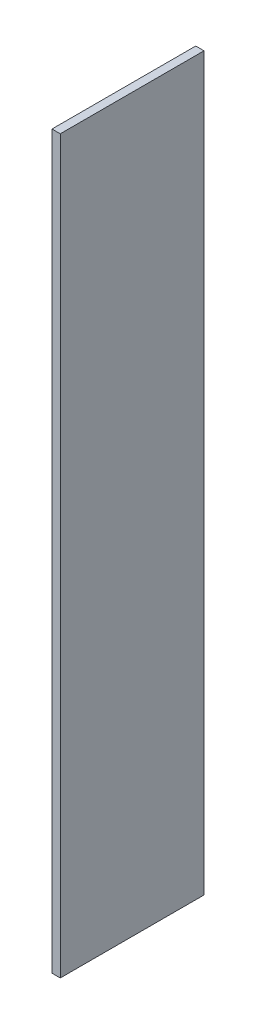
ISO-10303-21;
HEADER;
FILE_DESCRIPTION(('STEP AP214'),'2;1');
FILE_NAME('part.step','',(''),(''),'','','');
FILE_SCHEMA(('AUTOMOTIVE_DESIGN { 1 0 10303 214 1 1 1 1 }'));
ENDSEC;
DATA;
#1=APPLICATION_CONTEXT('core data for automotive mechanical design processes');
#2=APPLICATION_PROTOCOL_DEFINITION('international standard','automotive_design',2000,#1);
#3=PRODUCT_CONTEXT('',#1,'mechanical');
#4=PRODUCT('Part','Part','',(#3));
#5=PRODUCT_RELATED_PRODUCT_CATEGORY('part','',(#4));
#6=PRODUCT_DEFINITION_FORMATION('','',#4);
#7=PRODUCT_DEFINITION_CONTEXT('part definition',#1,'design');
#8=PRODUCT_DEFINITION('design','',#6,#7);
#9=PRODUCT_DEFINITION_SHAPE('','',#8);
#10=(LENGTH_UNIT() NAMED_UNIT(*) SI_UNIT(.MILLI.,.METRE.));
#11=(NAMED_UNIT(*) PLANE_ANGLE_UNIT() SI_UNIT($,.RADIAN.));
#12=(NAMED_UNIT(*) SI_UNIT($,.STERADIAN.) SOLID_ANGLE_UNIT());
#13=UNCERTAINTY_MEASURE_WITH_UNIT(LENGTH_MEASURE(1.E-05),#10,'distance_accuracy_value','');
#14=(GEOMETRIC_REPRESENTATION_CONTEXT(3) GLOBAL_UNCERTAINTY_ASSIGNED_CONTEXT((#13)) GLOBAL_UNIT_ASSIGNED_CONTEXT((#10,
#11,#12)) REPRESENTATION_CONTEXT('',''));
#15=CARTESIAN_POINT('',(0.,0.,0.));
#16=DIRECTION('',(0.,0.,1.));
#17=DIRECTION('',(1.,0.,0.));
#18=AXIS2_PLACEMENT_3D('',#15,#16,#17);
#19=CARTESIAN_POINT('',(3.2512,143.51,-28.2194));
#20=DIRECTION('',(0.,0.,1.));
#21=DIRECTION('',(0.,-1.,0.));
#22=AXIS2_PLACEMENT_3D('',#19,#20,#21);
#23=PLANE('',#22);
#24=DIRECTION('',(0.,1.,0.));
#25=VECTOR('',#24,1.);
#26=CARTESIAN_POINT('',(0.,143.51,-28.2194));
#27=LINE('',#26,#25);
#28=CARTESIAN_POINT('',(0.,-143.51,-28.2194));
#29=VERTEX_POINT('',#28);
#30=CARTESIAN_POINT('',(0.,143.51,-28.2194));
#31=VERTEX_POINT('',#30);
#32=EDGE_CURVE('E97',#29,#31,#27,.T.);
#33=ORIENTED_EDGE('',*,*,#32,.T.);
#34=DIRECTION('',(-1.,0.,0.));
#35=VECTOR('',#34,1.);
#36=CARTESIAN_POINT('',(3.2512,143.51,-28.2194));
#37=LINE('',#36,#35);
#38=CARTESIAN_POINT('',(3.2512,143.51,-28.2194));
#39=VERTEX_POINT('',#38);
#40=EDGE_CURVE('E11',#39,#31,#37,.T.);
#41=ORIENTED_EDGE('',*,*,#40,.F.);
#42=DIRECTION('',(0.,1.,0.));
#43=VECTOR('',#42,1.);
#44=CARTESIAN_POINT('',(3.2512,143.51,-28.2194));
#45=LINE('',#44,#43);
#46=CARTESIAN_POINT('',(3.2512,-143.51,-28.2194));
#47=VERTEX_POINT('',#46);
#48=EDGE_CURVE('E85',#47,#39,#45,.T.);
#49=ORIENTED_EDGE('',*,*,#48,.F.);
#50=DIRECTION('',(-1.,0.,0.));
#51=VECTOR('',#50,1.);
#52=CARTESIAN_POINT('',(3.2512,-143.51,-28.2194));
#53=LINE('',#52,#51);
#54=EDGE_CURVE('E93',#47,#29,#53,.T.);
#55=ORIENTED_EDGE('',*,*,#54,.T.);
#56=EDGE_LOOP('',(#33,#41,#49,#55));
#57=FACE_BOUND('',#56,.T.);
#58=ADVANCED_FACE('F34',(#57),#23,.F.);
#59=CARTESIAN_POINT('',(3.2512,143.51,28.2194));
#60=DIRECTION('',(0.,-1.,0.));
#61=DIRECTION('',(0.,0.,-1.));
#62=AXIS2_PLACEMENT_3D('',#59,#60,#61);
#63=PLANE('',#62);
#64=DIRECTION('',(0.,0.,1.));
#65=VECTOR('',#64,1.);
#66=CARTESIAN_POINT('',(0.,143.51,28.2194));
#67=LINE('',#66,#65);
#68=CARTESIAN_POINT('',(0.,143.51,28.2194));
#69=VERTEX_POINT('',#68);
#70=EDGE_CURVE('E89',#31,#69,#67,.T.);
#71=ORIENTED_EDGE('',*,*,#70,.T.);
#72=DIRECTION('',(-1.,0.,0.));
#73=VECTOR('',#72,1.);
#74=CARTESIAN_POINT('',(3.2512,143.51,28.2194));
#75=LINE('',#74,#73);
#76=CARTESIAN_POINT('',(3.2512,143.51,28.2194));
#77=VERTEX_POINT('',#76);
#78=EDGE_CURVE('E42',#77,#69,#75,.T.);
#79=ORIENTED_EDGE('',*,*,#78,.F.);
#80=DIRECTION('',(0.,0.,1.));
#81=VECTOR('',#80,1.);
#82=CARTESIAN_POINT('',(3.2512,143.51,28.2194));
#83=LINE('',#82,#81);
#84=EDGE_CURVE('E80',#39,#77,#83,.T.);
#85=ORIENTED_EDGE('',*,*,#84,.F.);
#86=ORIENTED_EDGE('',*,*,#40,.T.);
#87=EDGE_LOOP('',(#71,#79,#85,#86));
#88=FACE_BOUND('',#87,.T.);
#89=ADVANCED_FACE('F88',(#88),#63,.F.);
#90=CARTESIAN_POINT('',(3.2512,143.51,28.2194));
#91=DIRECTION('',(0.,0.,-1.));
#92=DIRECTION('',(0.,1.,0.));
#93=AXIS2_PLACEMENT_3D('',#90,#91,#92);
#94=PLANE('',#93);
#95=DIRECTION('',(0.,-1.,0.));
#96=VECTOR('',#95,1.);
#97=CARTESIAN_POINT('',(0.,143.51,28.2194));
#98=LINE('',#97,#96);
#99=CARTESIAN_POINT('',(0.,-143.51,28.2194));
#100=VERTEX_POINT('',#99);
#101=EDGE_CURVE('E67',#69,#100,#98,.T.);
#102=ORIENTED_EDGE('',*,*,#101,.T.);
#103=DIRECTION('',(-1.,0.,0.));
#104=VECTOR('',#103,1.);
#105=CARTESIAN_POINT('',(3.2512,-143.51,28.2194));
#106=LINE('',#105,#104);
#107=CARTESIAN_POINT('',(3.2512,-143.51,28.2194));
#108=VERTEX_POINT('',#107);
#109=EDGE_CURVE('E90',#108,#100,#106,.T.);
#110=ORIENTED_EDGE('',*,*,#109,.F.);
#111=DIRECTION('',(0.,-1.,0.));
#112=VECTOR('',#111,1.);
#113=CARTESIAN_POINT('',(3.2512,143.51,28.2194));
#114=LINE('',#113,#112);
#115=EDGE_CURVE('E83',#77,#108,#114,.T.);
#116=ORIENTED_EDGE('',*,*,#115,.F.);
#117=ORIENTED_EDGE('',*,*,#78,.T.);
#118=EDGE_LOOP('',(#102,#110,#116,#117));
#119=FACE_BOUND('',#118,.T.);
#120=ADVANCED_FACE('F91',(#119),#94,.F.);
#121=CARTESIAN_POINT('',(3.2512,-143.51,28.2194));
#122=DIRECTION('',(0.,1.,0.));
#123=DIRECTION('',(0.,0.,1.));
#124=AXIS2_PLACEMENT_3D('',#121,#122,#123);
#125=PLANE('',#124);
#126=DIRECTION('',(0.,0.,-1.));
#127=VECTOR('',#126,1.);
#128=CARTESIAN_POINT('',(0.,-143.51,28.2194));
#129=LINE('',#128,#127);
#130=EDGE_CURVE('E73',#100,#29,#129,.T.);
#131=ORIENTED_EDGE('',*,*,#130,.T.);
#132=ORIENTED_EDGE('',*,*,#54,.F.);
#133=DIRECTION('',(0.,0.,-1.));
#134=VECTOR('',#133,1.);
#135=CARTESIAN_POINT('',(3.2512,-143.51,28.2194));
#136=LINE('',#135,#134);
#137=EDGE_CURVE('E50',#108,#47,#136,.T.);
#138=ORIENTED_EDGE('',*,*,#137,.F.);
#139=ORIENTED_EDGE('',*,*,#109,.T.);
#140=EDGE_LOOP('',(#131,#132,#138,#139));
#141=FACE_BOUND('',#140,.T.);
#142=ADVANCED_FACE('F104',(#141),#125,.F.);
#143=CARTESIAN_POINT('',(3.2512,0.,0.));
#144=DIRECTION('',(1.,0.,0.));
#145=DIRECTION('',(0.,0.,-1.));
#146=AXIS2_PLACEMENT_3D('',#143,#144,#145);
#147=PLANE('',#146);
#148=ORIENTED_EDGE('',*,*,#48,.T.);
#149=ORIENTED_EDGE('',*,*,#84,.T.);
#150=ORIENTED_EDGE('',*,*,#115,.T.);
#151=ORIENTED_EDGE('',*,*,#137,.T.);
#152=EDGE_LOOP('',(#148,#149,#150,#151));
#153=FACE_BOUND('',#152,.T.);
#154=ADVANCED_FACE('F81',(#153),#147,.T.);
#155=CARTESIAN_POINT('',(0.,0.,0.));
#156=DIRECTION('',(1.,0.,0.));
#157=DIRECTION('',(0.,0.,-1.));
#158=AXIS2_PLACEMENT_3D('',#155,#156,#157);
#159=PLANE('',#158);
#160=ORIENTED_EDGE('',*,*,#32,.F.);
#161=ORIENTED_EDGE('',*,*,#130,.F.);
#162=ORIENTED_EDGE('',*,*,#101,.F.);
#163=ORIENTED_EDGE('',*,*,#70,.F.);
#164=EDGE_LOOP('',(#160,#161,#162,#163));
#165=FACE_BOUND('',#164,.T.);
#166=ADVANCED_FACE('F107',(#165),#159,.F.);
#167=CLOSED_SHELL('',(#58,#89,#120,#142,#154,#166));
#168=MANIFOLD_SOLID_BREP('B2',#167);
#169=ADVANCED_BREP_SHAPE_REPRESENTATION('',(#18,#168),#14);
#170=SHAPE_DEFINITION_REPRESENTATION(#9,#169);
ENDSEC;
END-ISO-10303-21;
